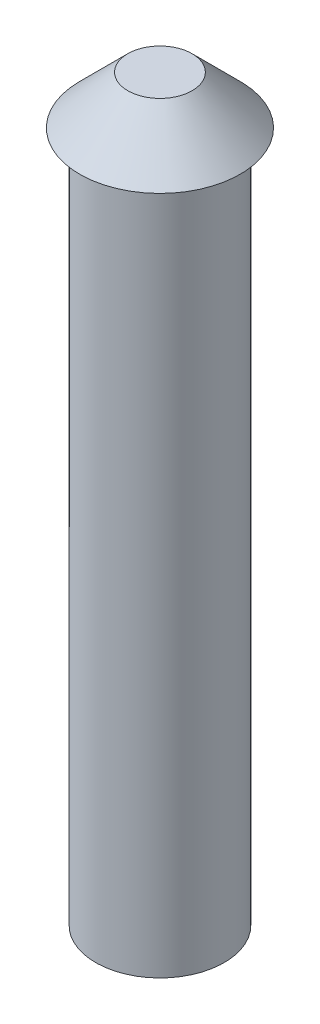
ISO-10303-21;
HEADER;
FILE_DESCRIPTION(('STEP AP214'),'2;1');
FILE_NAME('part.step','',(''),(''),'','','');
FILE_SCHEMA(('AUTOMOTIVE_DESIGN { 1 0 10303 214 1 1 1 1 }'));
ENDSEC;
DATA;
#1=APPLICATION_CONTEXT('core data for automotive mechanical design processes');
#2=APPLICATION_PROTOCOL_DEFINITION('international standard','automotive_design',2000,#1);
#3=PRODUCT_CONTEXT('',#1,'mechanical');
#4=PRODUCT('Part','Part','',(#3));
#5=PRODUCT_RELATED_PRODUCT_CATEGORY('part','',(#4));
#6=PRODUCT_DEFINITION_FORMATION('','',#4);
#7=PRODUCT_DEFINITION_CONTEXT('part definition',#1,'design');
#8=PRODUCT_DEFINITION('design','',#6,#7);
#9=PRODUCT_DEFINITION_SHAPE('','',#8);
#10=(LENGTH_UNIT() NAMED_UNIT(*) SI_UNIT(.MILLI.,.METRE.));
#11=(NAMED_UNIT(*) PLANE_ANGLE_UNIT() SI_UNIT($,.RADIAN.));
#12=(NAMED_UNIT(*) SI_UNIT($,.STERADIAN.) SOLID_ANGLE_UNIT());
#13=UNCERTAINTY_MEASURE_WITH_UNIT(LENGTH_MEASURE(1.E-05),#10,'distance_accuracy_value','');
#14=(GEOMETRIC_REPRESENTATION_CONTEXT(3) GLOBAL_UNCERTAINTY_ASSIGNED_CONTEXT((#13)) GLOBAL_UNIT_ASSIGNED_CONTEXT((#10,
#11,#12)) REPRESENTATION_CONTEXT('',''));
#15=CARTESIAN_POINT('',(0.,0.,0.));
#16=DIRECTION('',(0.,0.,1.));
#17=DIRECTION('',(1.,0.,0.));
#18=AXIS2_PLACEMENT_3D('',#15,#16,#17);
#19=CARTESIAN_POINT('',(0.,23.,0.));
#20=DIRECTION('',(0.,-1.,0.));
#21=DIRECTION('',(1.,0.,0.));
#22=AXIS2_PLACEMENT_3D('',#19,#20,#21);
#23=PLANE('',#22);
#24=CARTESIAN_POINT('',(0.,23.,0.));
#25=DIRECTION('',(0.,1.,0.));
#26=DIRECTION('',(-1.,0.,0.));
#27=AXIS2_PLACEMENT_3D('',#24,#25,#26);
#28=CIRCLE('',#27,2.);
#29=CARTESIAN_POINT('',(-2.,23.,0.));
#30=VERTEX_POINT('',#29);
#31=EDGE_CURVE('E10',#30,#30,#28,.T.);
#32=ORIENTED_EDGE('',*,*,#31,.T.);
#33=EDGE_LOOP('',(#32));
#34=FACE_BOUND('',#33,.T.);
#35=ADVANCED_FACE('F33',(#34),#23,.F.);
#36=CARTESIAN_POINT('',(0.,20.,0.));
#37=DIRECTION('',(0.,-1.,0.));
#38=DIRECTION('',(1.,0.,0.));
#39=AXIS2_PLACEMENT_3D('',#36,#37,#38);
#40=CONICAL_SURFACE('',#39,5.00000000000007,0.785398163397461);
#41=ORIENTED_EDGE('',*,*,#31,.F.);
#42=EDGE_LOOP('',(#41));
#43=FACE_BOUND('',#42,.T.);
#44=CARTESIAN_POINT('',(0.,20.,0.));
#45=DIRECTION('',(0.,1.,0.));
#46=DIRECTION('',(-1.,0.,0.));
#47=AXIS2_PLACEMENT_3D('',#44,#45,#46);
#48=CIRCLE('',#47,5.00000000000007);
#49=CARTESIAN_POINT('',(-5.00000000000007,20.,0.));
#50=VERTEX_POINT('',#49);
#51=EDGE_CURVE('E39',#50,#50,#48,.T.);
#52=ORIENTED_EDGE('',*,*,#51,.T.);
#53=EDGE_LOOP('',(#52));
#54=FACE_BOUND('',#53,.T.);
#55=ADVANCED_FACE('F65',(#43,#54),#40,.T.);
#56=CARTESIAN_POINT('',(4.,20.,0.));
#57=DIRECTION('',(0.,1.,0.));
#58=DIRECTION('',(-1.,0.,0.));
#59=AXIS2_PLACEMENT_3D('',#56,#57,#58);
#60=PLANE('',#59);
#61=ORIENTED_EDGE('',*,*,#51,.F.);
#62=EDGE_LOOP('',(#61));
#63=FACE_BOUND('',#62,.T.);
#64=CARTESIAN_POINT('',(0.,20.,0.));
#65=DIRECTION('',(0.,1.,0.));
#66=DIRECTION('',(-1.,0.,0.));
#67=AXIS2_PLACEMENT_3D('',#64,#65,#66);
#68=CIRCLE('',#67,4.);
#69=CARTESIAN_POINT('',(-4.,20.,0.));
#70=VERTEX_POINT('',#69);
#71=EDGE_CURVE('E43',#70,#70,#68,.T.);
#72=ORIENTED_EDGE('',*,*,#71,.T.);
#73=EDGE_LOOP('',(#72));
#74=FACE_BOUND('',#73,.T.);
#75=ADVANCED_FACE('F61',(#63,#74),#60,.F.);
#76=CARTESIAN_POINT('',(0.,23.,0.));
#77=DIRECTION('',(0.,1.,0.));
#78=DIRECTION('',(-1.,0.,0.));
#79=AXIS2_PLACEMENT_3D('',#76,#77,#78);
#80=CYLINDRICAL_SURFACE('',#79,4.);
#81=ORIENTED_EDGE('',*,*,#71,.F.);
#82=EDGE_LOOP('',(#81));
#83=FACE_BOUND('',#82,.T.);
#84=CARTESIAN_POINT('',(0.,-23.,0.));
#85=DIRECTION('',(0.,1.,0.));
#86=DIRECTION('',(-1.,0.,0.));
#87=AXIS2_PLACEMENT_3D('',#84,#85,#86);
#88=CIRCLE('',#87,3.99999999999999);
#89=CARTESIAN_POINT('',(-3.99999999999998,-23.,0.));
#90=VERTEX_POINT('',#89);
#91=EDGE_CURVE('E47',#90,#90,#88,.T.);
#92=ORIENTED_EDGE('',*,*,#91,.T.);
#93=EDGE_LOOP('',(#92));
#94=FACE_BOUND('',#93,.T.);
#95=ADVANCED_FACE('F53',(#83,#94),#80,.T.);
#96=CARTESIAN_POINT('',(4.00000000000001,-23.,0.));
#97=DIRECTION('',(0.,1.,0.));
#98=DIRECTION('',(-1.,0.,0.));
#99=AXIS2_PLACEMENT_3D('',#96,#97,#98);
#100=PLANE('',#99);
#101=ORIENTED_EDGE('',*,*,#91,.F.);
#102=EDGE_LOOP('',(#101));
#103=FACE_BOUND('',#102,.T.);
#104=ADVANCED_FACE('F55',(#103),#100,.F.);
#105=CLOSED_SHELL('',(#35,#55,#75,#95,#104));
#106=MANIFOLD_SOLID_BREP('B2',#105);
#107=ADVANCED_BREP_SHAPE_REPRESENTATION('',(#18,#106),#14);
#108=SHAPE_DEFINITION_REPRESENTATION(#9,#107);
ENDSEC;
END-ISO-10303-21;
